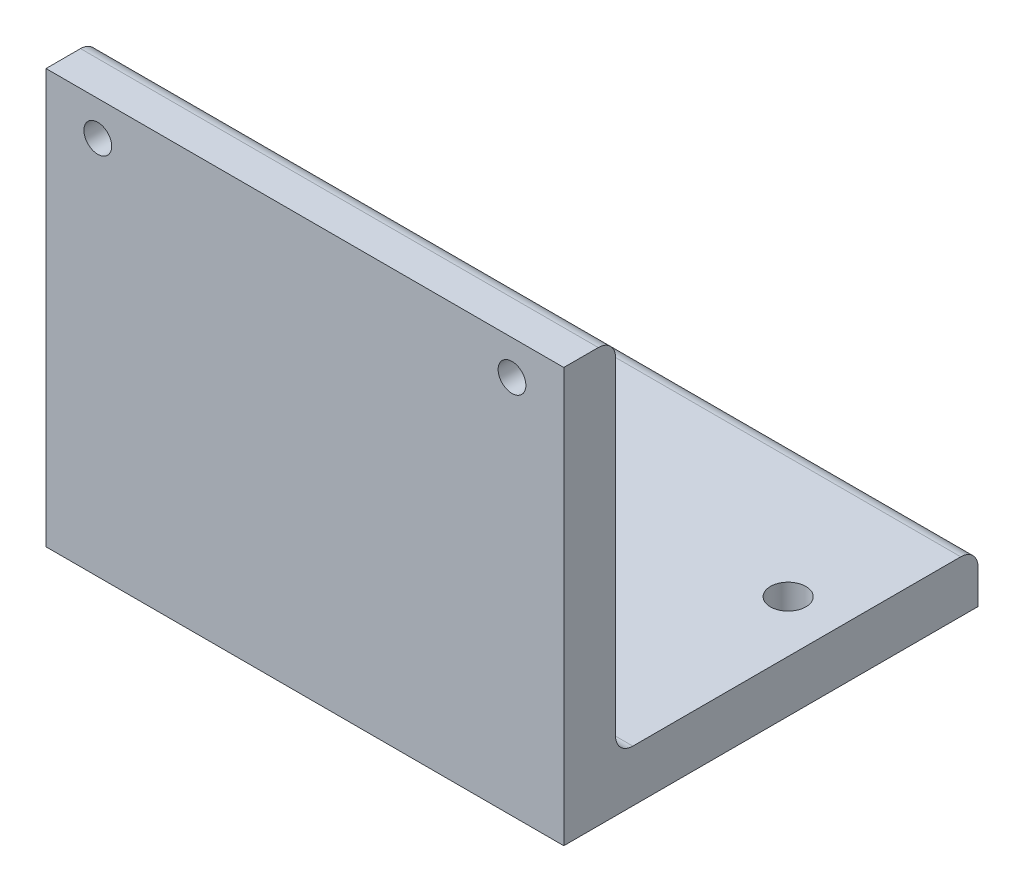
ISO-10303-21;
HEADER;
FILE_DESCRIPTION(('STEP AP214'),'2;1');
FILE_NAME('part.step','',(''),(''),'','','');
FILE_SCHEMA(('AUTOMOTIVE_DESIGN { 1 0 10303 214 1 1 1 1 }'));
ENDSEC;
DATA;
#1=APPLICATION_CONTEXT('core data for automotive mechanical design processes');
#2=APPLICATION_PROTOCOL_DEFINITION('international standard','automotive_design',2000,#1);
#3=PRODUCT_CONTEXT('',#1,'mechanical');
#4=PRODUCT('Part','Part','',(#3));
#5=PRODUCT_RELATED_PRODUCT_CATEGORY('part','',(#4));
#6=PRODUCT_DEFINITION_FORMATION('','',#4);
#7=PRODUCT_DEFINITION_CONTEXT('part definition',#1,'design');
#8=PRODUCT_DEFINITION('design','',#6,#7);
#9=PRODUCT_DEFINITION_SHAPE('','',#8);
#10=(LENGTH_UNIT() NAMED_UNIT(*) SI_UNIT(.MILLI.,.METRE.));
#11=(NAMED_UNIT(*) PLANE_ANGLE_UNIT() SI_UNIT($,.RADIAN.));
#12=(NAMED_UNIT(*) SI_UNIT($,.STERADIAN.) SOLID_ANGLE_UNIT());
#13=UNCERTAINTY_MEASURE_WITH_UNIT(LENGTH_MEASURE(1.E-05),#10,'distance_accuracy_value','');
#14=(GEOMETRIC_REPRESENTATION_CONTEXT(3) GLOBAL_UNCERTAINTY_ASSIGNED_CONTEXT((#13)) GLOBAL_UNIT_ASSIGNED_CONTEXT((#10,
#11,#12)) REPRESENTATION_CONTEXT('',''));
#15=CARTESIAN_POINT('',(0.,0.,0.));
#16=DIRECTION('',(0.,0.,1.));
#17=DIRECTION('',(1.,0.,0.));
#18=AXIS2_PLACEMENT_3D('',#15,#16,#17);
#19=CARTESIAN_POINT('',(47.625,9.52500000000001,-76.2));
#20=DIRECTION('',(0.,-1.,0.));
#21=DIRECTION('',(0.,0.,-1.));
#22=AXIS2_PLACEMENT_3D('',#19,#20,#21);
#23=PLANE('',#22);
#24=CARTESIAN_POINT('',(-38.1,9.525,-50.8));
#25=DIRECTION('',(0.,1.,0.));
#26=DIRECTION('',(0.,0.,1.));
#27=AXIS2_PLACEMENT_3D('',#24,#25,#26);
#28=CIRCLE('',#27,3.2639);
#29=CARTESIAN_POINT('',(-38.1,9.525,-47.5361));
#30=VERTEX_POINT('',#29);
#31=EDGE_CURVE('E271',#30,#30,#28,.T.);
#32=ORIENTED_EDGE('',*,*,#31,.F.);
#33=EDGE_LOOP('',(#32));
#34=FACE_BOUND('',#33,.T.);
#35=CARTESIAN_POINT('',(38.1,9.525,-50.8));
#36=DIRECTION('',(0.,1.,0.));
#37=DIRECTION('',(0.,0.,1.));
#38=AXIS2_PLACEMENT_3D('',#35,#36,#37);
#39=CIRCLE('',#38,3.2639);
#40=CARTESIAN_POINT('',(38.1,9.525,-47.5361));
#41=VERTEX_POINT('',#40);
#42=EDGE_CURVE('E265',#41,#41,#39,.T.);
#43=ORIENTED_EDGE('',*,*,#42,.F.);
#44=EDGE_LOOP('',(#43));
#45=FACE_BOUND('',#44,.T.);
#46=CARTESIAN_POINT('',(12.7,9.525,-25.4));
#47=DIRECTION('',(0.,1.,0.));
#48=DIRECTION('',(0.,0.,1.));
#49=AXIS2_PLACEMENT_3D('',#46,#47,#48);
#50=CIRCLE('',#49,3.2639);
#51=CARTESIAN_POINT('',(12.7,9.525,-22.1361));
#52=VERTEX_POINT('',#51);
#53=EDGE_CURVE('E250',#52,#52,#50,.T.);
#54=ORIENTED_EDGE('',*,*,#53,.F.);
#55=EDGE_LOOP('',(#54));
#56=FACE_BOUND('',#55,.T.);
#57=DIRECTION('',(0.,0.,1.));
#58=VECTOR('',#57,1.);
#59=CARTESIAN_POINT('',(-47.625,9.52500000000001,-76.2));
#60=LINE('',#59,#58);
#61=CARTESIAN_POINT('',(-47.625,9.52500000000001,-73.025));
#62=VERTEX_POINT('',#61);
#63=CARTESIAN_POINT('',(-47.625,9.525,-12.7));
#64=VERTEX_POINT('',#63);
#65=EDGE_CURVE('E187',#62,#64,#60,.T.);
#66=ORIENTED_EDGE('',*,*,#65,.T.);
#67=DIRECTION('',(-1.,0.,0.));
#68=VECTOR('',#67,1.);
#69=CARTESIAN_POINT('',(47.625,9.525,-12.7));
#70=LINE('',#69,#68);
#71=CARTESIAN_POINT('',(47.625,9.525,-12.7));
#72=VERTEX_POINT('',#71);
#73=EDGE_CURVE('E52',#64,#72,#70,.F.);
#74=ORIENTED_EDGE('',*,*,#73,.T.);
#75=DIRECTION('',(0.,0.,1.));
#76=VECTOR('',#75,1.);
#77=CARTESIAN_POINT('',(47.625,9.52500000000001,-76.2));
#78=LINE('',#77,#76);
#79=CARTESIAN_POINT('',(47.625,9.52500000000001,-73.025));
#80=VERTEX_POINT('',#79);
#81=EDGE_CURVE('E177',#80,#72,#78,.T.);
#82=ORIENTED_EDGE('',*,*,#81,.F.);
#83=DIRECTION('',(-1.,0.,0.));
#84=VECTOR('',#83,1.);
#85=CARTESIAN_POINT('',(47.625,9.52500000000001,-73.025));
#86=LINE('',#85,#84);
#87=EDGE_CURVE('E152',#80,#62,#86,.T.);
#88=ORIENTED_EDGE('',*,*,#87,.T.);
#89=EDGE_LOOP('',(#66,#74,#82,#88));
#90=FACE_BOUND('',#89,.T.);
#91=CARTESIAN_POINT('',(-12.7,9.525,-25.4));
#92=DIRECTION('',(0.,1.,0.));
#93=DIRECTION('',(0.,0.,1.));
#94=AXIS2_PLACEMENT_3D('',#91,#92,#93);
#95=CIRCLE('',#94,3.2639);
#96=CARTESIAN_POINT('',(-12.7,9.525,-22.1361));
#97=VERTEX_POINT('',#96);
#98=EDGE_CURVE('E259',#97,#97,#95,.T.);
#99=ORIENTED_EDGE('',*,*,#98,.F.);
#100=EDGE_LOOP('',(#99));
#101=FACE_BOUND('',#100,.T.);
#102=ADVANCED_FACE('F35',(#34,#45,#56,#90,#101),#23,.F.);
#103=CARTESIAN_POINT('',(47.625,76.2,-9.525));
#104=DIRECTION('',(0.,-1.,0.));
#105=DIRECTION('',(0.,0.,-1.));
#106=AXIS2_PLACEMENT_3D('',#103,#104,#105);
#107=PLANE('',#106);
#108=DIRECTION('',(0.,0.,1.));
#109=VECTOR('',#108,1.);
#110=CARTESIAN_POINT('',(47.625,76.2,-9.525));
#111=LINE('',#110,#109);
#112=CARTESIAN_POINT('',(47.625,76.2,-6.35));
#113=VERTEX_POINT('',#112);
#114=CARTESIAN_POINT('',(47.625,76.2,0.));
#115=VERTEX_POINT('',#114);
#116=EDGE_CURVE('E107',#113,#115,#111,.T.);
#117=ORIENTED_EDGE('',*,*,#116,.F.);
#118=DIRECTION('',(-1.,0.,0.));
#119=VECTOR('',#118,1.);
#120=CARTESIAN_POINT('',(47.625,76.2,-6.35));
#121=LINE('',#120,#119);
#122=CARTESIAN_POINT('',(-47.625,76.2,-6.35));
#123=VERTEX_POINT('',#122);
#124=EDGE_CURVE('E134',#113,#123,#121,.T.);
#125=ORIENTED_EDGE('',*,*,#124,.T.);
#126=DIRECTION('',(0.,0.,1.));
#127=VECTOR('',#126,1.);
#128=CARTESIAN_POINT('',(-47.625,76.2,-9.525));
#129=LINE('',#128,#127);
#130=CARTESIAN_POINT('',(-47.625,76.2,0.));
#131=VERTEX_POINT('',#130);
#132=EDGE_CURVE('E132',#123,#131,#129,.T.);
#133=ORIENTED_EDGE('',*,*,#132,.T.);
#134=DIRECTION('',(-1.,0.,0.));
#135=VECTOR('',#134,1.);
#136=CARTESIAN_POINT('',(47.625,76.2,0.));
#137=LINE('',#136,#135);
#138=EDGE_CURVE('E124',#115,#131,#137,.T.);
#139=ORIENTED_EDGE('',*,*,#138,.F.);
#140=EDGE_LOOP('',(#117,#125,#133,#139));
#141=FACE_BOUND('',#140,.T.);
#142=ADVANCED_FACE('F130',(#141),#107,.F.);
#143=CARTESIAN_POINT('',(47.625,76.2,0.));
#144=DIRECTION('',(0.,0.,-1.));
#145=DIRECTION('',(0.,1.,0.));
#146=AXIS2_PLACEMENT_3D('',#143,#144,#145);
#147=PLANE('',#146);
#148=CARTESIAN_POINT('',(-38.1,69.85,0.));
#149=DIRECTION('',(0.,0.,1.));
#150=DIRECTION('',(1.,0.,0.));
#151=AXIS2_PLACEMENT_3D('',#148,#149,#150);
#152=CIRCLE('',#151,2.5527);
#153=CARTESIAN_POINT('',(-35.5473,69.85,0.));
#154=VERTEX_POINT('',#153);
#155=EDGE_CURVE('E170',#154,#154,#152,.T.);
#156=ORIENTED_EDGE('',*,*,#155,.F.);
#157=EDGE_LOOP('',(#156));
#158=FACE_BOUND('',#157,.T.);
#159=CARTESIAN_POINT('',(38.1,69.85,0.));
#160=DIRECTION('',(0.,0.,1.));
#161=DIRECTION('',(1.,0.,0.));
#162=AXIS2_PLACEMENT_3D('',#159,#160,#161);
#163=CIRCLE('',#162,2.5527);
#164=CARTESIAN_POINT('',(40.6527,69.85,0.));
#165=VERTEX_POINT('',#164);
#166=EDGE_CURVE('E160',#165,#165,#163,.T.);
#167=ORIENTED_EDGE('',*,*,#166,.F.);
#168=EDGE_LOOP('',(#167));
#169=FACE_BOUND('',#168,.T.);
#170=DIRECTION('',(0.,-1.,0.));
#171=VECTOR('',#170,1.);
#172=CARTESIAN_POINT('',(-47.625,76.2,0.));
#173=LINE('',#172,#171);
#174=CARTESIAN_POINT('',(-47.625,0.,0.));
#175=VERTEX_POINT('',#174);
#176=EDGE_CURVE('E163',#131,#175,#173,.T.);
#177=ORIENTED_EDGE('',*,*,#176,.T.);
#178=DIRECTION('',(-1.,0.,0.));
#179=VECTOR('',#178,1.);
#180=CARTESIAN_POINT('',(47.625,0.,0.));
#181=LINE('',#180,#179);
#182=CARTESIAN_POINT('',(47.625,0.,0.));
#183=VERTEX_POINT('',#182);
#184=EDGE_CURVE('E126',#183,#175,#181,.T.);
#185=ORIENTED_EDGE('',*,*,#184,.F.);
#186=DIRECTION('',(0.,-1.,0.));
#187=VECTOR('',#186,1.);
#188=CARTESIAN_POINT('',(47.625,76.2,0.));
#189=LINE('',#188,#187);
#190=EDGE_CURVE('E111',#115,#183,#189,.T.);
#191=ORIENTED_EDGE('',*,*,#190,.F.);
#192=ORIENTED_EDGE('',*,*,#138,.T.);
#193=EDGE_LOOP('',(#177,#185,#191,#192));
#194=FACE_BOUND('',#193,.T.);
#195=ADVANCED_FACE('F123',(#158,#169,#194),#147,.F.);
#196=CARTESIAN_POINT('',(47.625,0.,0.));
#197=DIRECTION('',(0.,1.,0.));
#198=DIRECTION('',(0.,0.,1.));
#199=AXIS2_PLACEMENT_3D('',#196,#197,#198);
#200=PLANE('',#199);
#201=CARTESIAN_POINT('',(-38.1,0.,-50.8));
#202=DIRECTION('',(0.,1.,0.));
#203=DIRECTION('',(0.,0.,1.));
#204=AXIS2_PLACEMENT_3D('',#201,#202,#203);
#205=CIRCLE('',#204,3.2639);
#206=CARTESIAN_POINT('',(-38.1,0.,-47.5361));
#207=VERTEX_POINT('',#206);
#208=EDGE_CURVE('E268',#207,#207,#205,.T.);
#209=ORIENTED_EDGE('',*,*,#208,.T.);
#210=EDGE_LOOP('',(#209));
#211=FACE_BOUND('',#210,.T.);
#212=CARTESIAN_POINT('',(38.1,0.,-50.8));
#213=DIRECTION('',(0.,1.,0.));
#214=DIRECTION('',(0.,0.,1.));
#215=AXIS2_PLACEMENT_3D('',#212,#213,#214);
#216=CIRCLE('',#215,3.2639);
#217=CARTESIAN_POINT('',(38.1,0.,-47.5361));
#218=VERTEX_POINT('',#217);
#219=EDGE_CURVE('E262',#218,#218,#216,.T.);
#220=ORIENTED_EDGE('',*,*,#219,.T.);
#221=EDGE_LOOP('',(#220));
#222=FACE_BOUND('',#221,.T.);
#223=CARTESIAN_POINT('',(-12.7,0.,-25.4));
#224=DIRECTION('',(0.,1.,0.));
#225=DIRECTION('',(0.,0.,1.));
#226=AXIS2_PLACEMENT_3D('',#223,#224,#225);
#227=CIRCLE('',#226,3.2639);
#228=CARTESIAN_POINT('',(-12.7,0.,-22.1361));
#229=VERTEX_POINT('',#228);
#230=EDGE_CURVE('E254',#229,#229,#227,.T.);
#231=ORIENTED_EDGE('',*,*,#230,.T.);
#232=EDGE_LOOP('',(#231));
#233=FACE_BOUND('',#232,.T.);
#234=CARTESIAN_POINT('',(12.7,0.,-25.4));
#235=DIRECTION('',(0.,1.,0.));
#236=DIRECTION('',(0.,0.,1.));
#237=AXIS2_PLACEMENT_3D('',#234,#235,#236);
#238=CIRCLE('',#237,3.2639);
#239=CARTESIAN_POINT('',(12.7,0.,-22.1361));
#240=VERTEX_POINT('',#239);
#241=EDGE_CURVE('E248',#240,#240,#238,.T.);
#242=ORIENTED_EDGE('',*,*,#241,.T.);
#243=EDGE_LOOP('',(#242));
#244=FACE_BOUND('',#243,.T.);
#245=DIRECTION('',(0.,0.,-1.));
#246=VECTOR('',#245,1.);
#247=CARTESIAN_POINT('',(-47.625,0.,0.));
#248=LINE('',#247,#246);
#249=CARTESIAN_POINT('',(-47.625,0.,-76.2));
#250=VERTEX_POINT('',#249);
#251=EDGE_CURVE('E182',#175,#250,#248,.T.);
#252=ORIENTED_EDGE('',*,*,#251,.T.);
#253=DIRECTION('',(-1.,0.,0.));
#254=VECTOR('',#253,1.);
#255=CARTESIAN_POINT('',(47.625,0.,-76.2));
#256=LINE('',#255,#254);
#257=CARTESIAN_POINT('',(47.625,0.,-76.2));
#258=VERTEX_POINT('',#257);
#259=EDGE_CURVE('E138',#258,#250,#256,.T.);
#260=ORIENTED_EDGE('',*,*,#259,.F.);
#261=DIRECTION('',(0.,0.,-1.));
#262=VECTOR('',#261,1.);
#263=CARTESIAN_POINT('',(47.625,0.,0.));
#264=LINE('',#263,#262);
#265=EDGE_CURVE('E128',#183,#258,#264,.T.);
#266=ORIENTED_EDGE('',*,*,#265,.F.);
#267=ORIENTED_EDGE('',*,*,#184,.T.);
#268=EDGE_LOOP('',(#252,#260,#266,#267));
#269=FACE_BOUND('',#268,.T.);
#270=ADVANCED_FACE('F236',(#211,#222,#233,#244,#269),#200,.F.);
#271=CARTESIAN_POINT('',(47.625,0.,-76.2));
#272=DIRECTION('',(0.,0.,1.));
#273=DIRECTION('',(1.,0.,0.));
#274=AXIS2_PLACEMENT_3D('',#271,#272,#273);
#275=PLANE('',#274);
#276=DIRECTION('',(0.,1.,0.));
#277=VECTOR('',#276,1.);
#278=CARTESIAN_POINT('',(-47.625,0.,-76.2));
#279=LINE('',#278,#277);
#280=CARTESIAN_POINT('',(-47.625,6.35000000000001,-76.2));
#281=VERTEX_POINT('',#280);
#282=EDGE_CURVE('E184',#250,#281,#279,.T.);
#283=ORIENTED_EDGE('',*,*,#282,.T.);
#284=DIRECTION('',(-1.,0.,0.));
#285=VECTOR('',#284,1.);
#286=CARTESIAN_POINT('',(47.625,6.35000000000001,-76.2));
#287=LINE('',#286,#285);
#288=CARTESIAN_POINT('',(47.625,6.35000000000001,-76.2));
#289=VERTEX_POINT('',#288);
#290=EDGE_CURVE('E156',#281,#289,#287,.F.);
#291=ORIENTED_EDGE('',*,*,#290,.T.);
#292=DIRECTION('',(0.,1.,0.));
#293=VECTOR('',#292,1.);
#294=CARTESIAN_POINT('',(47.625,0.,-76.2));
#295=LINE('',#294,#293);
#296=EDGE_CURVE('E175',#258,#289,#295,.T.);
#297=ORIENTED_EDGE('',*,*,#296,.F.);
#298=ORIENTED_EDGE('',*,*,#259,.T.);
#299=EDGE_LOOP('',(#283,#291,#297,#298));
#300=FACE_BOUND('',#299,.T.);
#301=ADVANCED_FACE('F195',(#300),#275,.F.);
#302=CARTESIAN_POINT('',(47.625,9.525,-9.525));
#303=DIRECTION('',(0.,0.,1.));
#304=DIRECTION('',(1.,0.,0.));
#305=AXIS2_PLACEMENT_3D('',#302,#303,#304);
#306=PLANE('',#305);
#307=CARTESIAN_POINT('',(-38.1,69.85,-9.525));
#308=DIRECTION('',(0.,0.,1.));
#309=DIRECTION('',(1.,0.,0.));
#310=AXIS2_PLACEMENT_3D('',#307,#308,#309);
#311=CIRCLE('',#310,2.55269999999999);
#312=CARTESIAN_POINT('',(-35.5473,69.85,-9.525));
#313=VERTEX_POINT('',#312);
#314=EDGE_CURVE('E39',#313,#313,#311,.T.);
#315=ORIENTED_EDGE('',*,*,#314,.T.);
#316=EDGE_LOOP('',(#315));
#317=FACE_BOUND('',#316,.T.);
#318=CARTESIAN_POINT('',(38.1,69.85,-9.525));
#319=DIRECTION('',(0.,0.,1.));
#320=DIRECTION('',(1.,0.,0.));
#321=AXIS2_PLACEMENT_3D('',#318,#319,#320);
#322=CIRCLE('',#321,2.55269999999999);
#323=CARTESIAN_POINT('',(40.6527,69.85,-9.525));
#324=VERTEX_POINT('',#323);
#325=EDGE_CURVE('E158',#324,#324,#322,.T.);
#326=ORIENTED_EDGE('',*,*,#325,.T.);
#327=EDGE_LOOP('',(#326));
#328=FACE_BOUND('',#327,.T.);
#329=DIRECTION('',(0.,1.,0.));
#330=VECTOR('',#329,1.);
#331=CARTESIAN_POINT('',(-47.625,9.525,-9.525));
#332=LINE('',#331,#330);
#333=CARTESIAN_POINT('',(-47.625,12.7,-9.525));
#334=VERTEX_POINT('',#333);
#335=CARTESIAN_POINT('',(-47.625,73.025,-9.525));
#336=VERTEX_POINT('',#335);
#337=EDGE_CURVE('E119',#334,#336,#332,.T.);
#338=ORIENTED_EDGE('',*,*,#337,.T.);
#339=DIRECTION('',(-1.,0.,0.));
#340=VECTOR('',#339,1.);
#341=CARTESIAN_POINT('',(47.625,73.025,-9.525));
#342=LINE('',#341,#340);
#343=CARTESIAN_POINT('',(47.625,73.025,-9.525));
#344=VERTEX_POINT('',#343);
#345=EDGE_CURVE('E148',#336,#344,#342,.F.);
#346=ORIENTED_EDGE('',*,*,#345,.T.);
#347=DIRECTION('',(0.,1.,0.));
#348=VECTOR('',#347,1.);
#349=CARTESIAN_POINT('',(47.625,9.525,-9.525));
#350=LINE('',#349,#348);
#351=CARTESIAN_POINT('',(47.625,12.7,-9.525));
#352=VERTEX_POINT('',#351);
#353=EDGE_CURVE('E179',#352,#344,#350,.T.);
#354=ORIENTED_EDGE('',*,*,#353,.F.);
#355=DIRECTION('',(-1.,0.,0.));
#356=VECTOR('',#355,1.);
#357=CARTESIAN_POINT('',(-47.625,12.7,-9.525));
#358=LINE('',#357,#356);
#359=EDGE_CURVE('E145',#352,#334,#358,.T.);
#360=ORIENTED_EDGE('',*,*,#359,.T.);
#361=EDGE_LOOP('',(#338,#346,#354,#360));
#362=FACE_BOUND('',#361,.T.);
#363=ADVANCED_FACE('F212',(#317,#328,#362),#306,.F.);
#364=CARTESIAN_POINT('',(47.625,0.,0.));
#365=DIRECTION('',(1.,0.,0.));
#366=DIRECTION('',(0.,0.,-1.));
#367=AXIS2_PLACEMENT_3D('',#364,#365,#366);
#368=PLANE('',#367);
#369=ORIENTED_EDGE('',*,*,#353,.T.);
#370=CARTESIAN_POINT('',(47.625,73.025,-6.35));
#371=DIRECTION('',(1.,0.,0.));
#372=DIRECTION('',(0.,0.,-1.));
#373=AXIS2_PLACEMENT_3D('',#370,#371,#372);
#374=CIRCLE('',#373,3.175);
#375=EDGE_CURVE('E114',#344,#113,#374,.T.);
#376=ORIENTED_EDGE('',*,*,#375,.T.);
#377=ORIENTED_EDGE('',*,*,#116,.T.);
#378=ORIENTED_EDGE('',*,*,#190,.T.);
#379=ORIENTED_EDGE('',*,*,#265,.T.);
#380=ORIENTED_EDGE('',*,*,#296,.T.);
#381=CARTESIAN_POINT('',(47.625,6.35000000000001,-73.025));
#382=DIRECTION('',(1.,0.,0.));
#383=DIRECTION('',(0.,0.,-1.));
#384=AXIS2_PLACEMENT_3D('',#381,#382,#383);
#385=CIRCLE('',#384,3.175);
#386=EDGE_CURVE('E59',#289,#80,#385,.T.);
#387=ORIENTED_EDGE('',*,*,#386,.T.);
#388=ORIENTED_EDGE('',*,*,#81,.T.);
#389=CARTESIAN_POINT('',(47.625,12.7,-12.7));
#390=DIRECTION('',(1.,0.,0.));
#391=DIRECTION('',(0.,0.,-1.));
#392=AXIS2_PLACEMENT_3D('',#389,#390,#391);
#393=CIRCLE('',#392,3.175);
#394=EDGE_CURVE('E11',#72,#352,#393,.F.);
#395=ORIENTED_EDGE('',*,*,#394,.T.);
#396=EDGE_LOOP('',(#369,#376,#377,#378,#379,#380,#387,#388,#395));
#397=FACE_BOUND('',#396,.T.);
#398=ADVANCED_FACE('F110',(#397),#368,.T.);
#399=CARTESIAN_POINT('',(-47.625,0.,0.));
#400=DIRECTION('',(1.,0.,0.));
#401=DIRECTION('',(0.,0.,-1.));
#402=AXIS2_PLACEMENT_3D('',#399,#400,#401);
#403=PLANE('',#402);
#404=ORIENTED_EDGE('',*,*,#132,.F.);
#405=CARTESIAN_POINT('',(-47.625,73.025,-6.35));
#406=DIRECTION('',(1.,0.,0.));
#407=DIRECTION('',(0.,0.,-1.));
#408=AXIS2_PLACEMENT_3D('',#405,#406,#407);
#409=CIRCLE('',#408,3.175);
#410=EDGE_CURVE('E143',#123,#336,#409,.F.);
#411=ORIENTED_EDGE('',*,*,#410,.T.);
#412=ORIENTED_EDGE('',*,*,#337,.F.);
#413=CARTESIAN_POINT('',(-47.625,12.7,-12.7));
#414=DIRECTION('',(1.,0.,0.));
#415=DIRECTION('',(0.,0.,-1.));
#416=AXIS2_PLACEMENT_3D('',#413,#414,#415);
#417=CIRCLE('',#416,3.175);
#418=EDGE_CURVE('E44',#334,#64,#417,.T.);
#419=ORIENTED_EDGE('',*,*,#418,.T.);
#420=ORIENTED_EDGE('',*,*,#65,.F.);
#421=CARTESIAN_POINT('',(-47.625,6.35000000000001,-73.025));
#422=DIRECTION('',(1.,0.,0.));
#423=DIRECTION('',(0.,0.,-1.));
#424=AXIS2_PLACEMENT_3D('',#421,#422,#423);
#425=CIRCLE('',#424,3.175);
#426=EDGE_CURVE('E136',#62,#281,#425,.F.);
#427=ORIENTED_EDGE('',*,*,#426,.T.);
#428=ORIENTED_EDGE('',*,*,#282,.F.);
#429=ORIENTED_EDGE('',*,*,#251,.F.);
#430=ORIENTED_EDGE('',*,*,#176,.F.);
#431=EDGE_LOOP('',(#404,#411,#412,#419,#420,#427,#428,#429,#430));
#432=FACE_BOUND('',#431,.T.);
#433=ADVANCED_FACE('F200',(#432),#403,.F.);
#434=CARTESIAN_POINT('',(47.625,73.025,-6.35));
#435=DIRECTION('',(-1.,0.,0.));
#436=DIRECTION('',(0.,0.,1.));
#437=AXIS2_PLACEMENT_3D('',#434,#435,#436);
#438=CYLINDRICAL_SURFACE('',#437,3.175);
#439=ORIENTED_EDGE('',*,*,#375,.F.);
#440=ORIENTED_EDGE('',*,*,#345,.F.);
#441=ORIENTED_EDGE('',*,*,#410,.F.);
#442=ORIENTED_EDGE('',*,*,#124,.F.);
#443=EDGE_LOOP('',(#439,#440,#441,#442));
#444=FACE_BOUND('',#443,.T.);
#445=ADVANCED_FACE('F215',(#444),#438,.T.);
#446=CARTESIAN_POINT('',(47.625,12.7,-12.7));
#447=DIRECTION('',(1.,0.,0.));
#448=DIRECTION('',(0.,0.,-1.));
#449=AXIS2_PLACEMENT_3D('',#446,#447,#448);
#450=CYLINDRICAL_SURFACE('',#449,3.175);
#451=ORIENTED_EDGE('',*,*,#394,.F.);
#452=ORIENTED_EDGE('',*,*,#73,.F.);
#453=ORIENTED_EDGE('',*,*,#418,.F.);
#454=ORIENTED_EDGE('',*,*,#359,.F.);
#455=EDGE_LOOP('',(#451,#452,#453,#454));
#456=FACE_BOUND('',#455,.T.);
#457=ADVANCED_FACE('F209',(#456),#450,.F.);
#458=CARTESIAN_POINT('',(47.625,6.35000000000001,-73.025));
#459=DIRECTION('',(-1.,0.,0.));
#460=DIRECTION('',(0.,0.,1.));
#461=AXIS2_PLACEMENT_3D('',#458,#459,#460);
#462=CYLINDRICAL_SURFACE('',#461,3.175);
#463=ORIENTED_EDGE('',*,*,#386,.F.);
#464=ORIENTED_EDGE('',*,*,#290,.F.);
#465=ORIENTED_EDGE('',*,*,#426,.F.);
#466=ORIENTED_EDGE('',*,*,#87,.F.);
#467=EDGE_LOOP('',(#463,#464,#465,#466));
#468=FACE_BOUND('',#467,.T.);
#469=ADVANCED_FACE('F37',(#468),#462,.T.);
#470=CARTESIAN_POINT('',(38.1,69.85,0.));
#471=DIRECTION('',(0.,0.,1.));
#472=DIRECTION('',(1.,0.,0.));
#473=AXIS2_PLACEMENT_3D('',#470,#471,#472);
#474=CYLINDRICAL_SURFACE('',#473,2.55269999999999);
#475=ORIENTED_EDGE('',*,*,#166,.T.);
#476=EDGE_LOOP('',(#475));
#477=FACE_BOUND('',#476,.T.);
#478=ORIENTED_EDGE('',*,*,#325,.F.);
#479=EDGE_LOOP('',(#478));
#480=FACE_BOUND('',#479,.T.);
#481=ADVANCED_FACE('F297',(#477,#480),#474,.F.);
#482=CARTESIAN_POINT('',(-38.1,69.85,0.));
#483=DIRECTION('',(0.,0.,1.));
#484=DIRECTION('',(1.,0.,0.));
#485=AXIS2_PLACEMENT_3D('',#482,#483,#484);
#486=CYLINDRICAL_SURFACE('',#485,2.55269999999999);
#487=ORIENTED_EDGE('',*,*,#155,.T.);
#488=EDGE_LOOP('',(#487));
#489=FACE_BOUND('',#488,.T.);
#490=ORIENTED_EDGE('',*,*,#314,.F.);
#491=EDGE_LOOP('',(#490));
#492=FACE_BOUND('',#491,.T.);
#493=ADVANCED_FACE('F293',(#489,#492),#486,.F.);
#494=CARTESIAN_POINT('',(12.7,9.525,-25.4));
#495=DIRECTION('',(0.,1.,0.));
#496=DIRECTION('',(0.,0.,1.));
#497=AXIS2_PLACEMENT_3D('',#494,#495,#496);
#498=CYLINDRICAL_SURFACE('',#497,3.2639);
#499=ORIENTED_EDGE('',*,*,#241,.F.);
#500=EDGE_LOOP('',(#499));
#501=FACE_BOUND('',#500,.T.);
#502=ORIENTED_EDGE('',*,*,#53,.T.);
#503=EDGE_LOOP('',(#502));
#504=FACE_BOUND('',#503,.T.);
#505=ADVANCED_FACE('F289',(#501,#504),#498,.F.);
#506=CARTESIAN_POINT('',(-12.7,9.525,-25.4));
#507=DIRECTION('',(0.,1.,0.));
#508=DIRECTION('',(0.,0.,1.));
#509=AXIS2_PLACEMENT_3D('',#506,#507,#508);
#510=CYLINDRICAL_SURFACE('',#509,3.2639);
#511=ORIENTED_EDGE('',*,*,#230,.F.);
#512=EDGE_LOOP('',(#511));
#513=FACE_BOUND('',#512,.T.);
#514=ORIENTED_EDGE('',*,*,#98,.T.);
#515=EDGE_LOOP('',(#514));
#516=FACE_BOUND('',#515,.T.);
#517=ADVANCED_FACE('F282',(#513,#516),#510,.F.);
#518=CARTESIAN_POINT('',(38.1,9.525,-50.8));
#519=DIRECTION('',(0.,1.,0.));
#520=DIRECTION('',(0.,0.,1.));
#521=AXIS2_PLACEMENT_3D('',#518,#519,#520);
#522=CYLINDRICAL_SURFACE('',#521,3.2639);
#523=ORIENTED_EDGE('',*,*,#219,.F.);
#524=EDGE_LOOP('',(#523));
#525=FACE_BOUND('',#524,.T.);
#526=ORIENTED_EDGE('',*,*,#42,.T.);
#527=EDGE_LOOP('',(#526));
#528=FACE_BOUND('',#527,.T.);
#529=ADVANCED_FACE('F276',(#525,#528),#522,.F.);
#530=CARTESIAN_POINT('',(-38.1,9.525,-50.8));
#531=DIRECTION('',(0.,1.,0.));
#532=DIRECTION('',(0.,0.,1.));
#533=AXIS2_PLACEMENT_3D('',#530,#531,#532);
#534=CYLINDRICAL_SURFACE('',#533,3.2639);
#535=ORIENTED_EDGE('',*,*,#208,.F.);
#536=EDGE_LOOP('',(#535));
#537=FACE_BOUND('',#536,.T.);
#538=ORIENTED_EDGE('',*,*,#31,.T.);
#539=EDGE_LOOP('',(#538));
#540=FACE_BOUND('',#539,.T.);
#541=ADVANCED_FACE('F274',(#537,#540),#534,.F.);
#542=CLOSED_SHELL('',(#102,#142,#195,#270,#301,#363,#398,#433,#445,#457,#469,#481,#493,#505,
#517,#529,#541));
#543=MANIFOLD_SOLID_BREP('B2',#542);
#544=ADVANCED_BREP_SHAPE_REPRESENTATION('',(#18,#543),#14);
#545=SHAPE_DEFINITION_REPRESENTATION(#9,#544);
ENDSEC;
END-ISO-10303-21;
